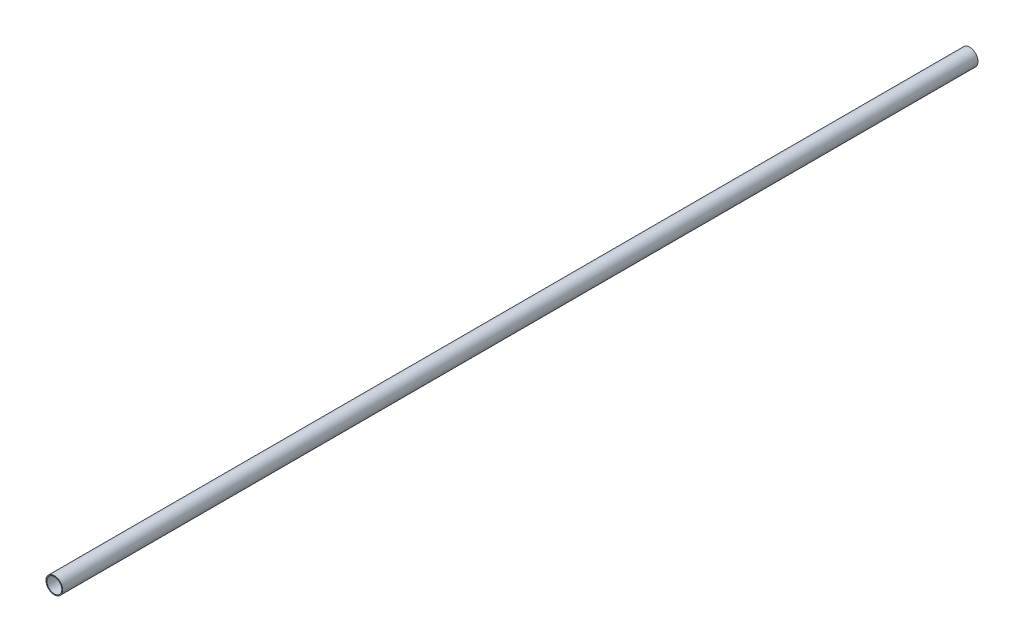
ISO-10303-21;
HEADER;
FILE_DESCRIPTION(('STEP AP214'),'2;1');
FILE_NAME('part.step','',(''),(''),'','','');
FILE_SCHEMA(('AUTOMOTIVE_DESIGN { 1 0 10303 214 1 1 1 1 }'));
ENDSEC;
DATA;
#1=APPLICATION_CONTEXT('core data for automotive mechanical design processes');
#2=APPLICATION_PROTOCOL_DEFINITION('international standard','automotive_design',2000,#1);
#3=PRODUCT_CONTEXT('',#1,'mechanical');
#4=PRODUCT('Part','Part','',(#3));
#5=PRODUCT_RELATED_PRODUCT_CATEGORY('part','',(#4));
#6=PRODUCT_DEFINITION_FORMATION('','',#4);
#7=PRODUCT_DEFINITION_CONTEXT('part definition',#1,'design');
#8=PRODUCT_DEFINITION('design','',#6,#7);
#9=PRODUCT_DEFINITION_SHAPE('','',#8);
#10=(LENGTH_UNIT() NAMED_UNIT(*) SI_UNIT(.MILLI.,.METRE.));
#11=(NAMED_UNIT(*) PLANE_ANGLE_UNIT() SI_UNIT($,.RADIAN.));
#12=(NAMED_UNIT(*) SI_UNIT($,.STERADIAN.) SOLID_ANGLE_UNIT());
#13=UNCERTAINTY_MEASURE_WITH_UNIT(LENGTH_MEASURE(1.E-05),#10,'distance_accuracy_value','');
#14=(GEOMETRIC_REPRESENTATION_CONTEXT(3) GLOBAL_UNCERTAINTY_ASSIGNED_CONTEXT((#13)) GLOBAL_UNIT_ASSIGNED_CONTEXT((#10,
#11,#12)) REPRESENTATION_CONTEXT('',''));
#15=CARTESIAN_POINT('',(0.,0.,0.));
#16=DIRECTION('',(0.,0.,1.));
#17=DIRECTION('',(1.,0.,0.));
#18=AXIS2_PLACEMENT_3D('',#15,#16,#17);
#19=CARTESIAN_POINT('',(0.,0.,1397.));
#20=DIRECTION('',(0.,0.,1.));
#21=DIRECTION('',(1.,0.,0.));
#22=AXIS2_PLACEMENT_3D('',#19,#20,#21);
#23=PLANE('',#22);
#24=CARTESIAN_POINT('',(0.,0.,1397.));
#25=DIRECTION('',(0.,0.,1.));
#26=DIRECTION('',(1.,0.,0.));
#27=AXIS2_PLACEMENT_3D('',#24,#25,#26);
#28=CIRCLE('',#27,12.7);
#29=CARTESIAN_POINT('',(12.7,0.,1397.));
#30=VERTEX_POINT('',#29);
#31=EDGE_CURVE('E10',#30,#30,#28,.T.);
#32=ORIENTED_EDGE('',*,*,#31,.T.);
#33=EDGE_LOOP('',(#32));
#34=FACE_BOUND('',#33,.T.);
#35=CARTESIAN_POINT('',(0.,0.,1397.));
#36=DIRECTION('',(0.,0.,1.));
#37=DIRECTION('',(1.,0.,0.));
#38=AXIS2_PLACEMENT_3D('',#35,#36,#37);
#39=CIRCLE('',#38,11.4554);
#40=CARTESIAN_POINT('',(11.4554,0.,1397.));
#41=VERTEX_POINT('',#40);
#42=EDGE_CURVE('E44',#41,#41,#39,.T.);
#43=ORIENTED_EDGE('',*,*,#42,.F.);
#44=EDGE_LOOP('',(#43));
#45=FACE_BOUND('',#44,.T.);
#46=ADVANCED_FACE('F33',(#34,#45),#23,.T.);
#47=CARTESIAN_POINT('',(0.,0.,0.));
#48=DIRECTION('',(0.,0.,1.));
#49=DIRECTION('',(1.,0.,0.));
#50=AXIS2_PLACEMENT_3D('',#47,#48,#49);
#51=PLANE('',#50);
#52=CARTESIAN_POINT('',(0.,0.,0.));
#53=DIRECTION('',(0.,0.,1.));
#54=DIRECTION('',(1.,0.,0.));
#55=AXIS2_PLACEMENT_3D('',#52,#53,#54);
#56=CIRCLE('',#55,12.7);
#57=CARTESIAN_POINT('',(12.7,0.,0.));
#58=VERTEX_POINT('',#57);
#59=EDGE_CURVE('E37',#58,#58,#56,.T.);
#60=ORIENTED_EDGE('',*,*,#59,.F.);
#61=EDGE_LOOP('',(#60));
#62=FACE_BOUND('',#61,.T.);
#63=CARTESIAN_POINT('',(0.,0.,0.));
#64=DIRECTION('',(0.,0.,1.));
#65=DIRECTION('',(1.,0.,0.));
#66=AXIS2_PLACEMENT_3D('',#63,#64,#65);
#67=CIRCLE('',#66,11.4554);
#68=CARTESIAN_POINT('',(11.4554,0.,0.));
#69=VERTEX_POINT('',#68);
#70=EDGE_CURVE('E46',#69,#69,#67,.T.);
#71=ORIENTED_EDGE('',*,*,#70,.T.);
#72=EDGE_LOOP('',(#71));
#73=FACE_BOUND('',#72,.T.);
#74=ADVANCED_FACE('F56',(#62,#73),#51,.F.);
#75=CARTESIAN_POINT('',(0.,0.,1397.));
#76=DIRECTION('',(0.,0.,-1.));
#77=DIRECTION('',(-1.,0.,0.));
#78=AXIS2_PLACEMENT_3D('',#75,#76,#77);
#79=CYLINDRICAL_SURFACE('',#78,12.7);
#80=ORIENTED_EDGE('',*,*,#31,.F.);
#81=EDGE_LOOP('',(#80));
#82=FACE_BOUND('',#81,.T.);
#83=ORIENTED_EDGE('',*,*,#59,.T.);
#84=EDGE_LOOP('',(#83));
#85=FACE_BOUND('',#84,.T.);
#86=ADVANCED_FACE('F35',(#82,#85),#79,.T.);
#87=CARTESIAN_POINT('',(0.,0.,1397.));
#88=DIRECTION('',(0.,0.,-1.));
#89=DIRECTION('',(-1.,0.,0.));
#90=AXIS2_PLACEMENT_3D('',#87,#88,#89);
#91=CYLINDRICAL_SURFACE('',#90,11.4554);
#92=ORIENTED_EDGE('',*,*,#42,.T.);
#93=EDGE_LOOP('',(#92));
#94=FACE_BOUND('',#93,.T.);
#95=ORIENTED_EDGE('',*,*,#70,.F.);
#96=EDGE_LOOP('',(#95));
#97=FACE_BOUND('',#96,.T.);
#98=ADVANCED_FACE('F52',(#94,#97),#91,.F.);
#99=CLOSED_SHELL('',(#46,#74,#86,#98));
#100=MANIFOLD_SOLID_BREP('B2',#99);
#101=ADVANCED_BREP_SHAPE_REPRESENTATION('',(#18,#100),#14);
#102=SHAPE_DEFINITION_REPRESENTATION(#9,#101);
ENDSEC;
END-ISO-10303-21;
